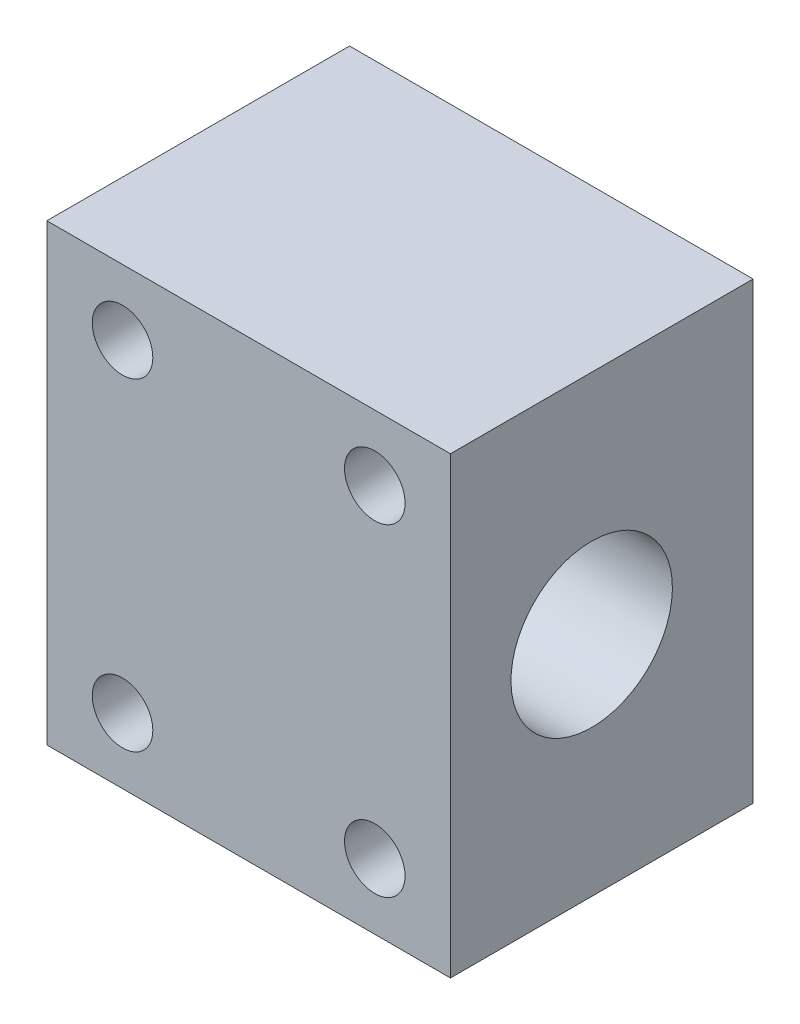
ISO-10303-21;
HEADER;
FILE_DESCRIPTION(('STEP AP214'),'2;1');
FILE_NAME('part.step','',(''),(''),'','','');
FILE_SCHEMA(('AUTOMOTIVE_DESIGN { 1 0 10303 214 1 1 1 1 }'));
ENDSEC;
DATA;
#1=APPLICATION_CONTEXT('core data for automotive mechanical design processes');
#2=APPLICATION_PROTOCOL_DEFINITION('international standard','automotive_design',2000,#1);
#3=PRODUCT_CONTEXT('',#1,'mechanical');
#4=PRODUCT('Part','Part','',(#3));
#5=PRODUCT_RELATED_PRODUCT_CATEGORY('part','',(#4));
#6=PRODUCT_DEFINITION_FORMATION('','',#4);
#7=PRODUCT_DEFINITION_CONTEXT('part definition',#1,'design');
#8=PRODUCT_DEFINITION('design','',#6,#7);
#9=PRODUCT_DEFINITION_SHAPE('','',#8);
#10=(LENGTH_UNIT() NAMED_UNIT(*) SI_UNIT(.MILLI.,.METRE.));
#11=(NAMED_UNIT(*) PLANE_ANGLE_UNIT() SI_UNIT($,.RADIAN.));
#12=(NAMED_UNIT(*) SI_UNIT($,.STERADIAN.) SOLID_ANGLE_UNIT());
#13=UNCERTAINTY_MEASURE_WITH_UNIT(LENGTH_MEASURE(1.E-05),#10,'distance_accuracy_value','');
#14=(GEOMETRIC_REPRESENTATION_CONTEXT(3) GLOBAL_UNCERTAINTY_ASSIGNED_CONTEXT((#13)) GLOBAL_UNIT_ASSIGNED_CONTEXT((#10,
#11,#12)) REPRESENTATION_CONTEXT('',''));
#15=CARTESIAN_POINT('',(0.,0.,0.));
#16=DIRECTION('',(0.,0.,1.));
#17=DIRECTION('',(1.,0.,0.));
#18=AXIS2_PLACEMENT_3D('',#15,#16,#17);
#19=CARTESIAN_POINT('',(20.,22.5,30.));
#20=DIRECTION('',(-1.,0.,0.));
#21=DIRECTION('',(0.,-1.,0.));
#22=AXIS2_PLACEMENT_3D('',#19,#20,#21);
#23=PLANE('',#22);
#24=CARTESIAN_POINT('',(20.,0.,16.));
#25=DIRECTION('',(1.,0.,0.));
#26=DIRECTION('',(0.,1.,0.));
#27=AXIS2_PLACEMENT_3D('',#24,#25,#26);
#28=CIRCLE('',#27,8.);
#29=CARTESIAN_POINT('',(20.,8.,16.));
#30=VERTEX_POINT('',#29);
#31=EDGE_CURVE('E131',#30,#30,#28,.T.);
#32=ORIENTED_EDGE('',*,*,#31,.F.);
#33=EDGE_LOOP('',(#32));
#34=FACE_BOUND('',#33,.T.);
#35=DIRECTION('',(0.,1.,0.));
#36=VECTOR('',#35,1.);
#37=CARTESIAN_POINT('',(20.,22.5,0.));
#38=LINE('',#37,#36);
#39=CARTESIAN_POINT('',(20.,-22.5,0.));
#40=VERTEX_POINT('',#39);
#41=CARTESIAN_POINT('',(20.,22.5,0.));
#42=VERTEX_POINT('',#41);
#43=EDGE_CURVE('E110',#40,#42,#38,.T.);
#44=ORIENTED_EDGE('',*,*,#43,.T.);
#45=DIRECTION('',(0.,0.,-1.));
#46=VECTOR('',#45,1.);
#47=CARTESIAN_POINT('',(20.,22.5,30.));
#48=LINE('',#47,#46);
#49=CARTESIAN_POINT('',(20.,22.5,30.));
#50=VERTEX_POINT('',#49);
#51=EDGE_CURVE('E11',#50,#42,#48,.T.);
#52=ORIENTED_EDGE('',*,*,#51,.F.);
#53=DIRECTION('',(0.,1.,0.));
#54=VECTOR('',#53,1.);
#55=CARTESIAN_POINT('',(20.,22.5,30.));
#56=LINE('',#55,#54);
#57=CARTESIAN_POINT('',(20.,-22.5,30.));
#58=VERTEX_POINT('',#57);
#59=EDGE_CURVE('E94',#58,#50,#56,.T.);
#60=ORIENTED_EDGE('',*,*,#59,.F.);
#61=DIRECTION('',(0.,0.,-1.));
#62=VECTOR('',#61,1.);
#63=CARTESIAN_POINT('',(20.,-22.5,30.));
#64=LINE('',#63,#62);
#65=EDGE_CURVE('E106',#58,#40,#64,.T.);
#66=ORIENTED_EDGE('',*,*,#65,.T.);
#67=EDGE_LOOP('',(#44,#52,#60,#66));
#68=FACE_BOUND('',#67,.T.);
#69=ADVANCED_FACE('F42',(#34,#68),#23,.F.);
#70=CARTESIAN_POINT('',(-20.,22.5,30.));
#71=DIRECTION('',(0.,-1.,0.));
#72=DIRECTION('',(0.,0.,-1.));
#73=AXIS2_PLACEMENT_3D('',#70,#71,#72);
#74=PLANE('',#73);
#75=DIRECTION('',(-1.,0.,0.));
#76=VECTOR('',#75,1.);
#77=CARTESIAN_POINT('',(-20.,22.5,0.));
#78=LINE('',#77,#76);
#79=CARTESIAN_POINT('',(-20.,22.5,0.));
#80=VERTEX_POINT('',#79);
#81=EDGE_CURVE('E99',#42,#80,#78,.T.);
#82=ORIENTED_EDGE('',*,*,#81,.T.);
#83=DIRECTION('',(0.,0.,-1.));
#84=VECTOR('',#83,1.);
#85=CARTESIAN_POINT('',(-20.,22.5,30.));
#86=LINE('',#85,#84);
#87=CARTESIAN_POINT('',(-20.,22.5,30.));
#88=VERTEX_POINT('',#87);
#89=EDGE_CURVE('E51',#88,#80,#86,.T.);
#90=ORIENTED_EDGE('',*,*,#89,.F.);
#91=DIRECTION('',(-1.,0.,0.));
#92=VECTOR('',#91,1.);
#93=CARTESIAN_POINT('',(-20.,22.5,30.));
#94=LINE('',#93,#92);
#95=EDGE_CURVE('E89',#50,#88,#94,.T.);
#96=ORIENTED_EDGE('',*,*,#95,.F.);
#97=ORIENTED_EDGE('',*,*,#51,.T.);
#98=EDGE_LOOP('',(#82,#90,#96,#97));
#99=FACE_BOUND('',#98,.T.);
#100=ADVANCED_FACE('F98',(#99),#74,.F.);
#101=CARTESIAN_POINT('',(-20.,22.5,30.));
#102=DIRECTION('',(1.,0.,0.));
#103=DIRECTION('',(0.,1.,0.));
#104=AXIS2_PLACEMENT_3D('',#101,#102,#103);
#105=PLANE('',#104);
#106=CARTESIAN_POINT('',(-20.,0.,16.));
#107=DIRECTION('',(1.,0.,0.));
#108=DIRECTION('',(0.,1.,0.));
#109=AXIS2_PLACEMENT_3D('',#106,#107,#108);
#110=CIRCLE('',#109,8.);
#111=CARTESIAN_POINT('',(-20.,7.99999999999999,16.));
#112=VERTEX_POINT('',#111);
#113=EDGE_CURVE('E114',#112,#112,#110,.T.);
#114=ORIENTED_EDGE('',*,*,#113,.T.);
#115=EDGE_LOOP('',(#114));
#116=FACE_BOUND('',#115,.T.);
#117=DIRECTION('',(0.,-1.,0.));
#118=VECTOR('',#117,1.);
#119=CARTESIAN_POINT('',(-20.,22.5,0.));
#120=LINE('',#119,#118);
#121=CARTESIAN_POINT('',(-20.,-22.5,0.));
#122=VERTEX_POINT('',#121);
#123=EDGE_CURVE('E76',#80,#122,#120,.T.);
#124=ORIENTED_EDGE('',*,*,#123,.T.);
#125=DIRECTION('',(0.,0.,-1.));
#126=VECTOR('',#125,1.);
#127=CARTESIAN_POINT('',(-20.,-22.5,30.));
#128=LINE('',#127,#126);
#129=CARTESIAN_POINT('',(-20.,-22.5,30.));
#130=VERTEX_POINT('',#129);
#131=EDGE_CURVE('E101',#130,#122,#128,.T.);
#132=ORIENTED_EDGE('',*,*,#131,.F.);
#133=DIRECTION('',(0.,-1.,0.));
#134=VECTOR('',#133,1.);
#135=CARTESIAN_POINT('',(-20.,22.5,30.));
#136=LINE('',#135,#134);
#137=EDGE_CURVE('E92',#88,#130,#136,.T.);
#138=ORIENTED_EDGE('',*,*,#137,.F.);
#139=ORIENTED_EDGE('',*,*,#89,.T.);
#140=EDGE_LOOP('',(#124,#132,#138,#139));
#141=FACE_BOUND('',#140,.T.);
#142=ADVANCED_FACE('F102',(#116,#141),#105,.F.);
#143=CARTESIAN_POINT('',(-20.,-22.5,30.));
#144=DIRECTION('',(0.,1.,0.));
#145=DIRECTION('',(0.,0.,1.));
#146=AXIS2_PLACEMENT_3D('',#143,#144,#145);
#147=PLANE('',#146);
#148=DIRECTION('',(1.,0.,0.));
#149=VECTOR('',#148,1.);
#150=CARTESIAN_POINT('',(-20.,-22.5,0.));
#151=LINE('',#150,#149);
#152=EDGE_CURVE('E82',#122,#40,#151,.T.);
#153=ORIENTED_EDGE('',*,*,#152,.T.);
#154=ORIENTED_EDGE('',*,*,#65,.F.);
#155=DIRECTION('',(1.,0.,0.));
#156=VECTOR('',#155,1.);
#157=CARTESIAN_POINT('',(-20.,-22.5,30.));
#158=LINE('',#157,#156);
#159=EDGE_CURVE('E59',#130,#58,#158,.T.);
#160=ORIENTED_EDGE('',*,*,#159,.F.);
#161=ORIENTED_EDGE('',*,*,#131,.T.);
#162=EDGE_LOOP('',(#153,#154,#160,#161));
#163=FACE_BOUND('',#162,.T.);
#164=ADVANCED_FACE('F124',(#163),#147,.F.);
#165=CARTESIAN_POINT('',(0.,0.,30.));
#166=DIRECTION('',(0.,0.,1.));
#167=DIRECTION('',(1.,0.,0.));
#168=AXIS2_PLACEMENT_3D('',#165,#166,#167);
#169=PLANE('',#168);
#170=CARTESIAN_POINT('',(-12.4999999999997,-16.,30.));
#171=DIRECTION('',(0.,0.,1.));
#172=DIRECTION('',(1.,0.,0.));
#173=AXIS2_PLACEMENT_3D('',#170,#171,#172);
#174=CIRCLE('',#173,3.);
#175=CARTESIAN_POINT('',(-9.49999999999967,-16.,30.));
#176=VERTEX_POINT('',#175);
#177=EDGE_CURVE('E151',#176,#176,#174,.T.);
#178=ORIENTED_EDGE('',*,*,#177,.F.);
#179=EDGE_LOOP('',(#178));
#180=FACE_BOUND('',#179,.T.);
#181=CARTESIAN_POINT('',(12.5000000000003,-16.,30.));
#182=DIRECTION('',(0.,0.,1.));
#183=DIRECTION('',(1.,0.,0.));
#184=AXIS2_PLACEMENT_3D('',#181,#182,#183);
#185=CIRCLE('',#184,3.);
#186=CARTESIAN_POINT('',(15.5000000000003,-16.,30.));
#187=VERTEX_POINT('',#186);
#188=EDGE_CURVE('E159',#187,#187,#185,.T.);
#189=ORIENTED_EDGE('',*,*,#188,.F.);
#190=EDGE_LOOP('',(#189));
#191=FACE_BOUND('',#190,.T.);
#192=CARTESIAN_POINT('',(12.5,16.,30.));
#193=DIRECTION('',(0.,0.,1.));
#194=DIRECTION('',(1.,0.,0.));
#195=AXIS2_PLACEMENT_3D('',#192,#193,#194);
#196=CIRCLE('',#195,3.);
#197=CARTESIAN_POINT('',(15.5,16.,30.));
#198=VERTEX_POINT('',#197);
#199=EDGE_CURVE('E143',#198,#198,#196,.T.);
#200=ORIENTED_EDGE('',*,*,#199,.F.);
#201=EDGE_LOOP('',(#200));
#202=FACE_BOUND('',#201,.T.);
#203=CARTESIAN_POINT('',(-12.5,16.,30.));
#204=DIRECTION('',(0.,0.,1.));
#205=DIRECTION('',(1.,0.,0.));
#206=AXIS2_PLACEMENT_3D('',#203,#204,#205);
#207=CIRCLE('',#206,3.);
#208=CARTESIAN_POINT('',(-9.5,16.,30.));
#209=VERTEX_POINT('',#208);
#210=EDGE_CURVE('E139',#209,#209,#207,.T.);
#211=ORIENTED_EDGE('',*,*,#210,.F.);
#212=EDGE_LOOP('',(#211));
#213=FACE_BOUND('',#212,.T.);
#214=ORIENTED_EDGE('',*,*,#59,.T.);
#215=ORIENTED_EDGE('',*,*,#95,.T.);
#216=ORIENTED_EDGE('',*,*,#137,.T.);
#217=ORIENTED_EDGE('',*,*,#159,.T.);
#218=EDGE_LOOP('',(#214,#215,#216,#217));
#219=FACE_BOUND('',#218,.T.);
#220=ADVANCED_FACE('F90',(#180,#191,#202,#213,#219),#169,.T.);
#221=CARTESIAN_POINT('',(0.,0.,0.));
#222=DIRECTION('',(0.,0.,1.));
#223=DIRECTION('',(1.,0.,0.));
#224=AXIS2_PLACEMENT_3D('',#221,#222,#223);
#225=PLANE('',#224);
#226=CARTESIAN_POINT('',(-12.4999999999997,-16.,0.));
#227=DIRECTION('',(0.,0.,1.));
#228=DIRECTION('',(1.,0.,0.));
#229=AXIS2_PLACEMENT_3D('',#226,#227,#228);
#230=CIRCLE('',#229,3.);
#231=CARTESIAN_POINT('',(-9.49999999999967,-16.,0.));
#232=VERTEX_POINT('',#231);
#233=EDGE_CURVE('E147',#232,#232,#230,.T.);
#234=ORIENTED_EDGE('',*,*,#233,.T.);
#235=EDGE_LOOP('',(#234));
#236=FACE_BOUND('',#235,.T.);
#237=CARTESIAN_POINT('',(12.5000000000003,-16.,0.));
#238=DIRECTION('',(0.,0.,1.));
#239=DIRECTION('',(1.,0.,0.));
#240=AXIS2_PLACEMENT_3D('',#237,#238,#239);
#241=CIRCLE('',#240,3.);
#242=CARTESIAN_POINT('',(15.5000000000003,-16.,0.));
#243=VERTEX_POINT('',#242);
#244=EDGE_CURVE('E155',#243,#243,#241,.T.);
#245=ORIENTED_EDGE('',*,*,#244,.T.);
#246=EDGE_LOOP('',(#245));
#247=FACE_BOUND('',#246,.T.);
#248=CARTESIAN_POINT('',(12.5,16.,0.));
#249=DIRECTION('',(0.,0.,1.));
#250=DIRECTION('',(1.,0.,0.));
#251=AXIS2_PLACEMENT_3D('',#248,#249,#250);
#252=CIRCLE('',#251,3.);
#253=CARTESIAN_POINT('',(15.5,16.,0.));
#254=VERTEX_POINT('',#253);
#255=EDGE_CURVE('E163',#254,#254,#252,.T.);
#256=ORIENTED_EDGE('',*,*,#255,.T.);
#257=EDGE_LOOP('',(#256));
#258=FACE_BOUND('',#257,.T.);
#259=CARTESIAN_POINT('',(-12.5,16.,0.));
#260=DIRECTION('',(0.,0.,1.));
#261=DIRECTION('',(1.,0.,0.));
#262=AXIS2_PLACEMENT_3D('',#259,#260,#261);
#263=CIRCLE('',#262,3.);
#264=CARTESIAN_POINT('',(-9.5,16.,0.));
#265=VERTEX_POINT('',#264);
#266=EDGE_CURVE('E135',#265,#265,#263,.T.);
#267=ORIENTED_EDGE('',*,*,#266,.T.);
#268=EDGE_LOOP('',(#267));
#269=FACE_BOUND('',#268,.T.);
#270=ORIENTED_EDGE('',*,*,#43,.F.);
#271=ORIENTED_EDGE('',*,*,#152,.F.);
#272=ORIENTED_EDGE('',*,*,#123,.F.);
#273=ORIENTED_EDGE('',*,*,#81,.F.);
#274=EDGE_LOOP('',(#270,#271,#272,#273));
#275=FACE_BOUND('',#274,.T.);
#276=ADVANCED_FACE('F127',(#236,#247,#258,#269,#275),#225,.F.);
#277=CARTESIAN_POINT('',(-20.,0.,16.));
#278=DIRECTION('',(1.,0.,0.));
#279=DIRECTION('',(0.,1.,0.));
#280=AXIS2_PLACEMENT_3D('',#277,#278,#279);
#281=CYLINDRICAL_SURFACE('',#280,8.);
#282=ORIENTED_EDGE('',*,*,#113,.F.);
#283=EDGE_LOOP('',(#282));
#284=FACE_BOUND('',#283,.T.);
#285=ORIENTED_EDGE('',*,*,#31,.T.);
#286=EDGE_LOOP('',(#285));
#287=FACE_BOUND('',#286,.T.);
#288=ADVANCED_FACE('F181',(#284,#287),#281,.F.);
#289=CARTESIAN_POINT('',(-12.5,16.,0.));
#290=DIRECTION('',(0.,0.,1.));
#291=DIRECTION('',(1.,0.,0.));
#292=AXIS2_PLACEMENT_3D('',#289,#290,#291);
#293=CYLINDRICAL_SURFACE('',#292,3.);
#294=ORIENTED_EDGE('',*,*,#266,.F.);
#295=EDGE_LOOP('',(#294));
#296=FACE_BOUND('',#295,.T.);
#297=ORIENTED_EDGE('',*,*,#210,.T.);
#298=EDGE_LOOP('',(#297));
#299=FACE_BOUND('',#298,.T.);
#300=ADVANCED_FACE('F179',(#296,#299),#293,.F.);
#301=CARTESIAN_POINT('',(12.5,16.,0.));
#302=DIRECTION('',(0.,0.,1.));
#303=DIRECTION('',(1.,0.,0.));
#304=AXIS2_PLACEMENT_3D('',#301,#302,#303);
#305=CYLINDRICAL_SURFACE('',#304,3.);
#306=ORIENTED_EDGE('',*,*,#255,.F.);
#307=EDGE_LOOP('',(#306));
#308=FACE_BOUND('',#307,.T.);
#309=ORIENTED_EDGE('',*,*,#199,.T.);
#310=EDGE_LOOP('',(#309));
#311=FACE_BOUND('',#310,.T.);
#312=ADVANCED_FACE('F171',(#308,#311),#305,.F.);
#313=CARTESIAN_POINT('',(12.5000000000003,-16.,0.));
#314=DIRECTION('',(0.,0.,1.));
#315=DIRECTION('',(1.,0.,0.));
#316=AXIS2_PLACEMENT_3D('',#313,#314,#315);
#317=CYLINDRICAL_SURFACE('',#316,3.);
#318=ORIENTED_EDGE('',*,*,#244,.F.);
#319=EDGE_LOOP('',(#318));
#320=FACE_BOUND('',#319,.T.);
#321=ORIENTED_EDGE('',*,*,#188,.T.);
#322=EDGE_LOOP('',(#321));
#323=FACE_BOUND('',#322,.T.);
#324=ADVANCED_FACE('F188',(#320,#323),#317,.F.);
#325=CARTESIAN_POINT('',(-12.4999999999997,-16.,0.));
#326=DIRECTION('',(0.,0.,1.));
#327=DIRECTION('',(1.,0.,0.));
#328=AXIS2_PLACEMENT_3D('',#325,#326,#327);
#329=CYLINDRICAL_SURFACE('',#328,3.);
#330=ORIENTED_EDGE('',*,*,#233,.F.);
#331=EDGE_LOOP('',(#330));
#332=FACE_BOUND('',#331,.T.);
#333=ORIENTED_EDGE('',*,*,#177,.T.);
#334=EDGE_LOOP('',(#333));
#335=FACE_BOUND('',#334,.T.);
#336=ADVANCED_FACE('F223',(#332,#335),#329,.F.);
#337=CLOSED_SHELL('',(#69,#100,#142,#164,#220,#276,#288,#300,#312,#324,#336));
#338=MANIFOLD_SOLID_BREP('B2',#337);
#339=ADVANCED_BREP_SHAPE_REPRESENTATION('',(#18,#338),#14);
#340=SHAPE_DEFINITION_REPRESENTATION(#9,#339);
ENDSEC;
END-ISO-10303-21;
